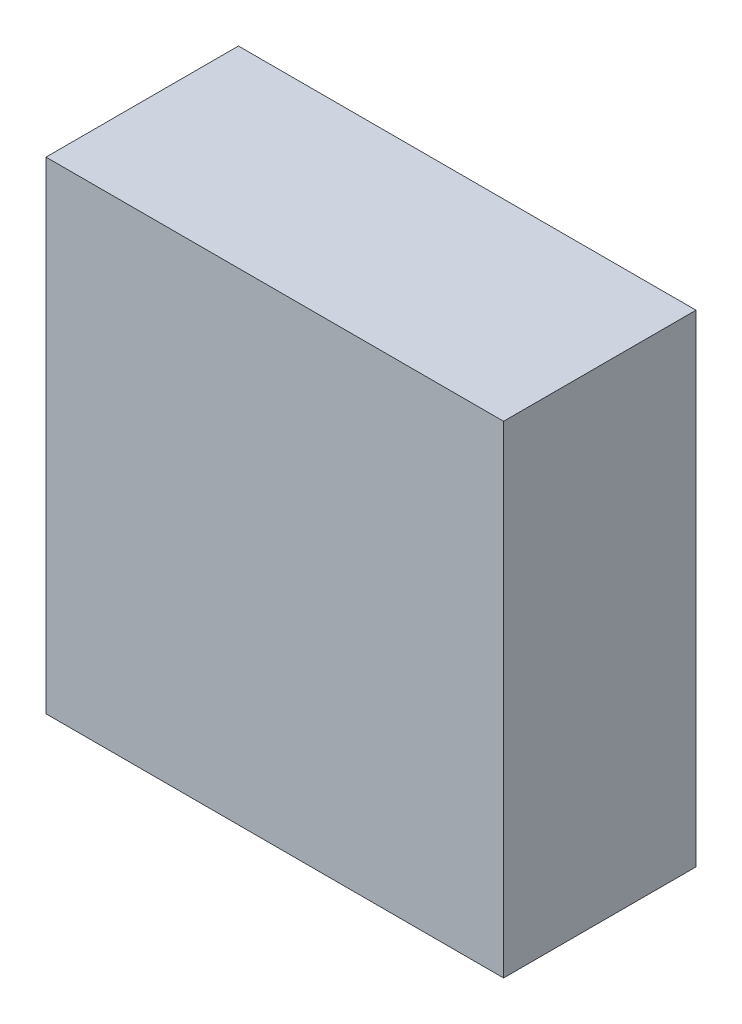
ISO-10303-21;
HEADER;
FILE_DESCRIPTION(('STEP AP214'),'2;1');
FILE_NAME('part.step','',(''),(''),'','','');
FILE_SCHEMA(('AUTOMOTIVE_DESIGN { 1 0 10303 214 1 1 1 1 }'));
ENDSEC;
DATA;
#1=APPLICATION_CONTEXT('core data for automotive mechanical design processes');
#2=APPLICATION_PROTOCOL_DEFINITION('international standard','automotive_design',2000,#1);
#3=PRODUCT_CONTEXT('',#1,'mechanical');
#4=PRODUCT('Part','Part','',(#3));
#5=PRODUCT_RELATED_PRODUCT_CATEGORY('part','',(#4));
#6=PRODUCT_DEFINITION_FORMATION('','',#4);
#7=PRODUCT_DEFINITION_CONTEXT('part definition',#1,'design');
#8=PRODUCT_DEFINITION('design','',#6,#7);
#9=PRODUCT_DEFINITION_SHAPE('','',#8);
#10=(LENGTH_UNIT() NAMED_UNIT(*) SI_UNIT(.MILLI.,.METRE.));
#11=(NAMED_UNIT(*) PLANE_ANGLE_UNIT() SI_UNIT($,.RADIAN.));
#12=(NAMED_UNIT(*) SI_UNIT($,.STERADIAN.) SOLID_ANGLE_UNIT());
#13=UNCERTAINTY_MEASURE_WITH_UNIT(LENGTH_MEASURE(1.E-05),#10,'distance_accuracy_value','');
#14=(GEOMETRIC_REPRESENTATION_CONTEXT(3) GLOBAL_UNCERTAINTY_ASSIGNED_CONTEXT((#13)) GLOBAL_UNIT_ASSIGNED_CONTEXT((#10,
#11,#12)) REPRESENTATION_CONTEXT('',''));
#15=CARTESIAN_POINT('',(0.,0.,0.));
#16=DIRECTION('',(0.,0.,1.));
#17=DIRECTION('',(1.,0.,0.));
#18=AXIS2_PLACEMENT_3D('',#15,#16,#17);
#19=CARTESIAN_POINT('',(-8.7363554,-4.9470056,3.9509446));
#20=DIRECTION('',(1.,0.,0.));
#21=DIRECTION('',(0.,0.,-1.));
#22=AXIS2_PLACEMENT_3D('',#19,#20,#21);
#23=PLANE('',#22);
#24=DIRECTION('',(0.,-1.,0.));
#25=VECTOR('',#24,1.);
#26=CARTESIAN_POINT('',(-8.7363554,-4.9470056,0.));
#27=LINE('',#26,#25);
#28=CARTESIAN_POINT('',(-8.7363554,4.953,0.));
#29=VERTEX_POINT('',#28);
#30=CARTESIAN_POINT('',(-8.7363554,-4.9470056,0.));
#31=VERTEX_POINT('',#30);
#32=EDGE_CURVE('E95',#29,#31,#27,.T.);
#33=ORIENTED_EDGE('',*,*,#32,.T.);
#34=DIRECTION('',(0.,0.,-1.));
#35=VECTOR('',#34,1.);
#36=CARTESIAN_POINT('',(-8.7363554,-4.9470056,3.9509446));
#37=LINE('',#36,#35);
#38=CARTESIAN_POINT('',(-8.7363554,-4.9470056,3.9509446));
#39=VERTEX_POINT('',#38);
#40=EDGE_CURVE('E11',#39,#31,#37,.T.);
#41=ORIENTED_EDGE('',*,*,#40,.F.);
#42=DIRECTION('',(0.,-1.,0.));
#43=VECTOR('',#42,1.);
#44=CARTESIAN_POINT('',(-8.7363554,-4.9470056,3.9509446));
#45=LINE('',#44,#43);
#46=CARTESIAN_POINT('',(-8.7363554,4.953,3.9509446));
#47=VERTEX_POINT('',#46);
#48=EDGE_CURVE('E83',#47,#39,#45,.T.);
#49=ORIENTED_EDGE('',*,*,#48,.F.);
#50=DIRECTION('',(0.,0.,-1.));
#51=VECTOR('',#50,1.);
#52=CARTESIAN_POINT('',(-8.7363554,4.953,3.9509446));
#53=LINE('',#52,#51);
#54=EDGE_CURVE('E91',#47,#29,#53,.T.);
#55=ORIENTED_EDGE('',*,*,#54,.T.);
#56=EDGE_LOOP('',(#33,#41,#49,#55));
#57=FACE_BOUND('',#56,.T.);
#58=ADVANCED_FACE('F32',(#57),#23,.F.);
#59=CARTESIAN_POINT('',(0.659155400000001,-4.9470056,3.9509446));
#60=DIRECTION('',(0.,1.,0.));
#61=DIRECTION('',(0.,0.,1.));
#62=AXIS2_PLACEMENT_3D('',#59,#60,#61);
#63=PLANE('',#62);
#64=DIRECTION('',(1.,0.,0.));
#65=VECTOR('',#64,1.);
#66=CARTESIAN_POINT('',(0.659155400000001,-4.9470056,0.));
#67=LINE('',#66,#65);
#68=CARTESIAN_POINT('',(0.659155400000001,-4.9470056,0.));
#69=VERTEX_POINT('',#68);
#70=EDGE_CURVE('E87',#31,#69,#67,.T.);
#71=ORIENTED_EDGE('',*,*,#70,.T.);
#72=DIRECTION('',(0.,0.,-1.));
#73=VECTOR('',#72,1.);
#74=CARTESIAN_POINT('',(0.659155400000001,-4.9470056,3.9509446));
#75=LINE('',#74,#73);
#76=CARTESIAN_POINT('',(0.659155400000001,-4.9470056,3.9509446));
#77=VERTEX_POINT('',#76);
#78=EDGE_CURVE('E40',#77,#69,#75,.T.);
#79=ORIENTED_EDGE('',*,*,#78,.F.);
#80=DIRECTION('',(1.,0.,0.));
#81=VECTOR('',#80,1.);
#82=CARTESIAN_POINT('',(0.659155400000001,-4.9470056,3.9509446));
#83=LINE('',#82,#81);
#84=EDGE_CURVE('E78',#39,#77,#83,.T.);
#85=ORIENTED_EDGE('',*,*,#84,.F.);
#86=ORIENTED_EDGE('',*,*,#40,.T.);
#87=EDGE_LOOP('',(#71,#79,#85,#86));
#88=FACE_BOUND('',#87,.T.);
#89=ADVANCED_FACE('F86',(#88),#63,.F.);
#90=CARTESIAN_POINT('',(0.659155400000001,4.953,3.9509446));
#91=DIRECTION('',(-1.,0.,0.));
#92=DIRECTION('',(0.,0.,1.));
#93=AXIS2_PLACEMENT_3D('',#90,#91,#92);
#94=PLANE('',#93);
#95=DIRECTION('',(0.,1.,0.));
#96=VECTOR('',#95,1.);
#97=CARTESIAN_POINT('',(0.659155400000001,4.953,0.));
#98=LINE('',#97,#96);
#99=CARTESIAN_POINT('',(0.659155400000001,4.953,0.));
#100=VERTEX_POINT('',#99);
#101=EDGE_CURVE('E65',#69,#100,#98,.T.);
#102=ORIENTED_EDGE('',*,*,#101,.T.);
#103=DIRECTION('',(0.,0.,-1.));
#104=VECTOR('',#103,1.);
#105=CARTESIAN_POINT('',(0.659155400000001,4.953,3.9509446));
#106=LINE('',#105,#104);
#107=CARTESIAN_POINT('',(0.659155400000001,4.953,3.9509446));
#108=VERTEX_POINT('',#107);
#109=EDGE_CURVE('E88',#108,#100,#106,.T.);
#110=ORIENTED_EDGE('',*,*,#109,.F.);
#111=DIRECTION('',(0.,1.,0.));
#112=VECTOR('',#111,1.);
#113=CARTESIAN_POINT('',(0.659155400000001,4.953,3.9509446));
#114=LINE('',#113,#112);
#115=EDGE_CURVE('E81',#77,#108,#114,.T.);
#116=ORIENTED_EDGE('',*,*,#115,.F.);
#117=ORIENTED_EDGE('',*,*,#78,.T.);
#118=EDGE_LOOP('',(#102,#110,#116,#117));
#119=FACE_BOUND('',#118,.T.);
#120=ADVANCED_FACE('F89',(#119),#94,.F.);
#121=CARTESIAN_POINT('',(-8.7363554,4.953,3.9509446));
#122=DIRECTION('',(0.,-1.,0.));
#123=DIRECTION('',(0.,0.,-1.));
#124=AXIS2_PLACEMENT_3D('',#121,#122,#123);
#125=PLANE('',#124);
#126=DIRECTION('',(-1.,0.,0.));
#127=VECTOR('',#126,1.);
#128=CARTESIAN_POINT('',(-8.7363554,4.953,0.));
#129=LINE('',#128,#127);
#130=EDGE_CURVE('E71',#100,#29,#129,.T.);
#131=ORIENTED_EDGE('',*,*,#130,.T.);
#132=ORIENTED_EDGE('',*,*,#54,.F.);
#133=DIRECTION('',(-1.,0.,0.));
#134=VECTOR('',#133,1.);
#135=CARTESIAN_POINT('',(-8.7363554,4.953,3.9509446));
#136=LINE('',#135,#134);
#137=EDGE_CURVE('E48',#108,#47,#136,.T.);
#138=ORIENTED_EDGE('',*,*,#137,.F.);
#139=ORIENTED_EDGE('',*,*,#109,.T.);
#140=EDGE_LOOP('',(#131,#132,#138,#139));
#141=FACE_BOUND('',#140,.T.);
#142=ADVANCED_FACE('F102',(#141),#125,.F.);
#143=CARTESIAN_POINT('',(0.,0.,3.9509446));
#144=DIRECTION('',(0.,0.,-1.));
#145=DIRECTION('',(-1.,0.,0.));
#146=AXIS2_PLACEMENT_3D('',#143,#144,#145);
#147=PLANE('',#146);
#148=ORIENTED_EDGE('',*,*,#48,.T.);
#149=ORIENTED_EDGE('',*,*,#84,.T.);
#150=ORIENTED_EDGE('',*,*,#115,.T.);
#151=ORIENTED_EDGE('',*,*,#137,.T.);
#152=EDGE_LOOP('',(#148,#149,#150,#151));
#153=FACE_BOUND('',#152,.T.);
#154=ADVANCED_FACE('F79',(#153),#147,.F.);
#155=CARTESIAN_POINT('',(0.,0.,0.));
#156=DIRECTION('',(0.,0.,-1.));
#157=DIRECTION('',(-1.,0.,0.));
#158=AXIS2_PLACEMENT_3D('',#155,#156,#157);
#159=PLANE('',#158);
#160=ORIENTED_EDGE('',*,*,#32,.F.);
#161=ORIENTED_EDGE('',*,*,#130,.F.);
#162=ORIENTED_EDGE('',*,*,#101,.F.);
#163=ORIENTED_EDGE('',*,*,#70,.F.);
#164=EDGE_LOOP('',(#160,#161,#162,#163));
#165=FACE_BOUND('',#164,.T.);
#166=ADVANCED_FACE('F105',(#165),#159,.T.);
#167=CLOSED_SHELL('',(#58,#89,#120,#142,#154,#166));
#168=MANIFOLD_SOLID_BREP('B2',#167);
#169=ADVANCED_BREP_SHAPE_REPRESENTATION('',(#18,#168),#14);
#170=SHAPE_DEFINITION_REPRESENTATION(#9,#169);
ENDSEC;
END-ISO-10303-21;
